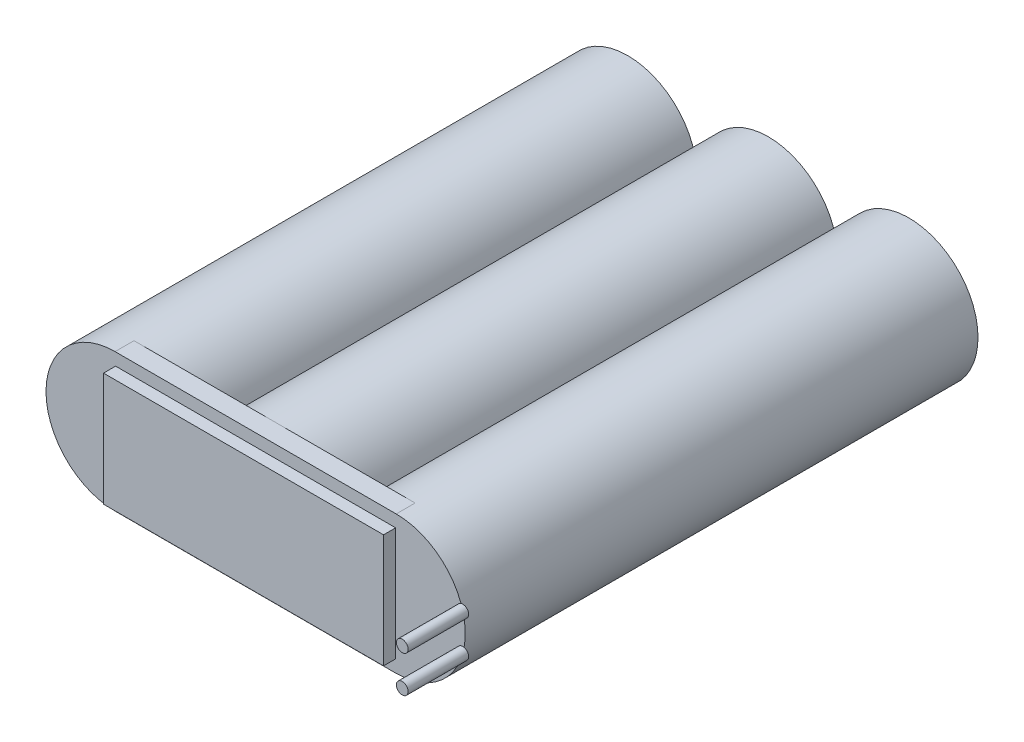
ISO-10303-21;
HEADER;
FILE_DESCRIPTION(('STEP AP214'),'2;1');
FILE_NAME('part.step','',(''),(''),'','','');
FILE_SCHEMA(('AUTOMOTIVE_DESIGN { 1 0 10303 214 1 1 1 1 }'));
ENDSEC;
DATA;
#1=APPLICATION_CONTEXT('core data for automotive mechanical design processes');
#2=APPLICATION_PROTOCOL_DEFINITION('international standard','automotive_design',2000,#1);
#3=PRODUCT_CONTEXT('',#1,'mechanical');
#4=PRODUCT('Part','Part','',(#3));
#5=PRODUCT_RELATED_PRODUCT_CATEGORY('part','',(#4));
#6=PRODUCT_DEFINITION_FORMATION('','',#4);
#7=PRODUCT_DEFINITION_CONTEXT('part definition',#1,'design');
#8=PRODUCT_DEFINITION('design','',#6,#7);
#9=PRODUCT_DEFINITION_SHAPE('','',#8);
#10=(LENGTH_UNIT() NAMED_UNIT(*) SI_UNIT(.MILLI.,.METRE.));
#11=(NAMED_UNIT(*) PLANE_ANGLE_UNIT() SI_UNIT($,.RADIAN.));
#12=(NAMED_UNIT(*) SI_UNIT($,.STERADIAN.) SOLID_ANGLE_UNIT());
#13=UNCERTAINTY_MEASURE_WITH_UNIT(LENGTH_MEASURE(1.E-05),#10,'distance_accuracy_value','');
#14=(GEOMETRIC_REPRESENTATION_CONTEXT(3) GLOBAL_UNCERTAINTY_ASSIGNED_CONTEXT((#13)) GLOBAL_UNIT_ASSIGNED_CONTEXT((#10,
#11,#12)) REPRESENTATION_CONTEXT('',''));
#15=CARTESIAN_POINT('',(0.,0.,0.));
#16=DIRECTION('',(0.,0.,1.));
#17=DIRECTION('',(1.,0.,0.));
#18=AXIS2_PLACEMENT_3D('',#15,#16,#17);
#19=CARTESIAN_POINT('',(-18.575,0.,32.625));
#20=DIRECTION('',(0.,0.,1.));
#21=DIRECTION('',(1.,0.,0.));
#22=AXIS2_PLACEMENT_3D('',#19,#20,#21);
#23=PLANE('',#22);
#24=CARTESIAN_POINT('',(18.575,0.,32.625));
#25=DIRECTION('',(0.,0.,1.));
#26=DIRECTION('',(1.,0.,0.));
#27=AXIS2_PLACEMENT_3D('',#24,#25,#26);
#28=CIRCLE('',#27,9.125);
#29=CARTESIAN_POINT('',(18.575,9.12500000000001,32.625));
#30=VERTEX_POINT('',#29);
#31=CARTESIAN_POINT('',(18.575,-9.125,32.625));
#32=VERTEX_POINT('',#31);
#33=EDGE_CURVE('E169',#30,#32,#28,.T.);
#34=ORIENTED_EDGE('',*,*,#33,.T.);
#35=DIRECTION('',(1.,0.,0.));
#36=VECTOR('',#35,1.);
#37=CARTESIAN_POINT('',(-18.575,-9.12500000000001,32.625));
#38=LINE('',#37,#36);
#39=CARTESIAN_POINT('',(0.,-9.12500000000001,32.625));
#40=VERTEX_POINT('',#39);
#41=EDGE_CURVE('E172',#40,#32,#38,.T.);
#42=ORIENTED_EDGE('',*,*,#41,.F.);
#43=CARTESIAN_POINT('',(0.,0.,32.625));
#44=DIRECTION('',(0.,0.,1.));
#45=DIRECTION('',(1.,0.,0.));
#46=AXIS2_PLACEMENT_3D('',#43,#44,#45);
#47=CIRCLE('',#46,9.125);
#48=CARTESIAN_POINT('',(0.,9.12500000000001,32.625));
#49=VERTEX_POINT('',#48);
#50=EDGE_CURVE('E54',#40,#49,#47,.T.);
#51=ORIENTED_EDGE('',*,*,#50,.T.);
#52=DIRECTION('',(-1.,0.,0.));
#53=VECTOR('',#52,1.);
#54=CARTESIAN_POINT('',(-18.575,9.12500000000001,32.625));
#55=LINE('',#54,#53);
#56=EDGE_CURVE('E163',#30,#49,#55,.T.);
#57=ORIENTED_EDGE('',*,*,#56,.F.);
#58=EDGE_LOOP('',(#34,#42,#51,#57));
#59=FACE_BOUND('',#58,.T.);
#60=ADVANCED_FACE('F45',(#59),#23,.F.);
#61=CARTESIAN_POINT('',(0.,0.,32.625));
#62=DIRECTION('',(0.,0.,-1.));
#63=DIRECTION('',(-1.,0.,0.));
#64=AXIS2_PLACEMENT_3D('',#61,#62,#63);
#65=CYLINDRICAL_SURFACE('',#64,9.125);
#66=EDGE_CURVE('E13',#49,#40,#47,.T.);
#67=ORIENTED_EDGE('',*,*,#66,.F.);
#68=ORIENTED_EDGE('',*,*,#50,.F.);
#69=EDGE_LOOP('',(#67,#68));
#70=FACE_BOUND('',#69,.T.);
#71=CARTESIAN_POINT('',(0.,0.,-32.625));
#72=DIRECTION('',(0.,0.,1.));
#73=DIRECTION('',(1.,0.,0.));
#74=AXIS2_PLACEMENT_3D('',#71,#72,#73);
#75=CIRCLE('',#74,9.125);
#76=CARTESIAN_POINT('',(9.125,0.,-32.625));
#77=VERTEX_POINT('',#76);
#78=EDGE_CURVE('E49',#77,#77,#75,.T.);
#79=ORIENTED_EDGE('',*,*,#78,.T.);
#80=EDGE_LOOP('',(#79));
#81=FACE_BOUND('',#80,.T.);
#82=ADVANCED_FACE('F47',(#70,#81),#65,.T.);
#83=CARTESIAN_POINT('',(0.,0.,-32.625));
#84=DIRECTION('',(0.,0.,1.));
#85=DIRECTION('',(1.,0.,0.));
#86=AXIS2_PLACEMENT_3D('',#83,#84,#85);
#87=PLANE('',#86);
#88=ORIENTED_EDGE('',*,*,#78,.F.);
#89=EDGE_LOOP('',(#88));
#90=FACE_BOUND('',#89,.T.);
#91=ADVANCED_FACE('F239',(#90),#87,.F.);
#92=CARTESIAN_POINT('',(-18.575,0.,32.625));
#93=DIRECTION('',(0.,0.,1.));
#94=DIRECTION('',(1.,0.,0.));
#95=AXIS2_PLACEMENT_3D('',#92,#93,#94);
#96=CIRCLE('',#95,9.125);
#97=CARTESIAN_POINT('',(-18.575,-9.12500000000001,32.625));
#98=VERTEX_POINT('',#97);
#99=CARTESIAN_POINT('',(-18.575,9.12500000000001,32.625));
#100=VERTEX_POINT('',#99);
#101=EDGE_CURVE('E170',#98,#100,#96,.T.);
#102=ORIENTED_EDGE('',*,*,#101,.T.);
#103=EDGE_CURVE('E257',#49,#100,#55,.T.);
#104=ORIENTED_EDGE('',*,*,#103,.F.);
#105=ORIENTED_EDGE('',*,*,#66,.T.);
#106=EDGE_CURVE('E260',#98,#40,#38,.T.);
#107=ORIENTED_EDGE('',*,*,#106,.F.);
#108=EDGE_LOOP('',(#102,#104,#105,#107));
#109=FACE_BOUND('',#108,.T.);
#110=ADVANCED_FACE('F235',(#109),#23,.F.);
#111=CARTESIAN_POINT('',(-18.575,0.,35.125));
#112=DIRECTION('',(0.,0.,-1.));
#113=DIRECTION('',(-1.,0.,0.));
#114=AXIS2_PLACEMENT_3D('',#111,#112,#113);
#115=CYLINDRICAL_SURFACE('',#114,9.12500000000001);
#116=DIRECTION('',(0.,0.,-1.));
#117=VECTOR('',#116,1.);
#118=CARTESIAN_POINT('',(-18.575,9.12500000000001,35.125));
#119=LINE('',#118,#117);
#120=CARTESIAN_POINT('',(-18.575,9.12500000000001,35.125));
#121=VERTEX_POINT('',#120);
#122=EDGE_CURVE('E155',#121,#100,#119,.T.);
#123=ORIENTED_EDGE('',*,*,#122,.T.);
#124=ORIENTED_EDGE('',*,*,#101,.F.);
#125=DIRECTION('',(0.,0.,-1.));
#126=VECTOR('',#125,1.);
#127=CARTESIAN_POINT('',(-18.575,-9.12500000000001,35.125));
#128=LINE('',#127,#126);
#129=CARTESIAN_POINT('',(-18.575,-9.12500000000001,35.125));
#130=VERTEX_POINT('',#129);
#131=EDGE_CURVE('E280',#130,#98,#128,.T.);
#132=ORIENTED_EDGE('',*,*,#131,.F.);
#133=CARTESIAN_POINT('',(-18.575,0.,35.125));
#134=DIRECTION('',(0.,0.,1.));
#135=DIRECTION('',(1.,0.,0.));
#136=AXIS2_PLACEMENT_3D('',#133,#134,#135);
#137=CIRCLE('',#136,9.12500000000001);
#138=EDGE_CURVE('E162',#121,#130,#137,.T.);
#139=ORIENTED_EDGE('',*,*,#138,.F.);
#140=EDGE_LOOP('',(#123,#124,#132,#139));
#141=FACE_BOUND('',#140,.T.);
#142=CARTESIAN_POINT('',(-18.575,0.,-32.625));
#143=DIRECTION('',(0.,0.,1.));
#144=DIRECTION('',(1.,0.,0.));
#145=AXIS2_PLACEMENT_3D('',#142,#143,#144);
#146=CIRCLE('',#145,9.125);
#147=CARTESIAN_POINT('',(-9.45,0.,-32.625));
#148=VERTEX_POINT('',#147);
#149=EDGE_CURVE('E173',#148,#148,#146,.T.);
#150=ORIENTED_EDGE('',*,*,#149,.T.);
#151=EDGE_LOOP('',(#150));
#152=FACE_BOUND('',#151,.T.);
#153=ADVANCED_FACE('F244',(#141,#152),#115,.T.);
#154=CARTESIAN_POINT('',(-18.575,-9.12500000000001,35.125));
#155=DIRECTION('',(0.,1.,0.));
#156=DIRECTION('',(0.,0.,1.));
#157=AXIS2_PLACEMENT_3D('',#154,#155,#156);
#158=PLANE('',#157);
#159=ORIENTED_EDGE('',*,*,#106,.T.);
#160=ORIENTED_EDGE('',*,*,#41,.T.);
#161=DIRECTION('',(0.,0.,-1.));
#162=VECTOR('',#161,1.);
#163=CARTESIAN_POINT('',(18.575,-9.125,35.125));
#164=LINE('',#163,#162);
#165=CARTESIAN_POINT('',(18.575,-9.125,35.125));
#166=VERTEX_POINT('',#165);
#167=EDGE_CURVE('E275',#166,#32,#164,.T.);
#168=ORIENTED_EDGE('',*,*,#167,.F.);
#169=DIRECTION('',(1.,0.,0.));
#170=VECTOR('',#169,1.);
#171=CARTESIAN_POINT('',(-18.575,-9.12500000000001,35.125));
#172=LINE('',#171,#170);
#173=EDGE_CURVE('E151',#130,#166,#172,.T.);
#174=ORIENTED_EDGE('',*,*,#173,.F.);
#175=ORIENTED_EDGE('',*,*,#131,.T.);
#176=EDGE_LOOP('',(#159,#160,#168,#174,#175));
#177=FACE_BOUND('',#176,.T.);
#178=ADVANCED_FACE('F250',(#177),#158,.F.);
#179=CARTESIAN_POINT('',(18.575,0.,35.125));
#180=DIRECTION('',(0.,0.,-1.));
#181=DIRECTION('',(-1.,0.,0.));
#182=AXIS2_PLACEMENT_3D('',#179,#180,#181);
#183=CYLINDRICAL_SURFACE('',#182,9.12500000000001);
#184=ORIENTED_EDGE('',*,*,#167,.T.);
#185=ORIENTED_EDGE('',*,*,#33,.F.);
#186=DIRECTION('',(0.,0.,-1.));
#187=VECTOR('',#186,1.);
#188=CARTESIAN_POINT('',(18.575,9.12500000000001,35.125));
#189=LINE('',#188,#187);
#190=CARTESIAN_POINT('',(18.575,9.12500000000001,35.125));
#191=VERTEX_POINT('',#190);
#192=EDGE_CURVE('E273',#191,#30,#189,.T.);
#193=ORIENTED_EDGE('',*,*,#192,.F.);
#194=CARTESIAN_POINT('',(18.575,0.,35.125));
#195=DIRECTION('',(0.,0.,1.));
#196=DIRECTION('',(1.,0.,0.));
#197=AXIS2_PLACEMENT_3D('',#194,#195,#196);
#198=CIRCLE('',#197,9.12500000000001);
#199=CARTESIAN_POINT('',(27.1361699272627,3.15784649350352,35.125));
#200=VERTEX_POINT('',#199);
#201=EDGE_CURVE('E148',#200,#191,#198,.T.);
#202=ORIENTED_EDGE('',*,*,#201,.F.);
#203=CARTESIAN_POINT('',(27.5468676049892,1.6646971732257,35.125));
#204=VERTEX_POINT('',#203);
#205=EDGE_CURVE('E154',#204,#200,#198,.T.);
#206=ORIENTED_EDGE('',*,*,#205,.F.);
#207=CARTESIAN_POINT('',(27.5468676049892,-1.6646971732257,35.125));
#208=VERTEX_POINT('',#207);
#209=EDGE_CURVE('E146',#208,#204,#198,.T.);
#210=ORIENTED_EDGE('',*,*,#209,.F.);
#211=CARTESIAN_POINT('',(27.1361699272627,-3.15784649350352,35.125));
#212=VERTEX_POINT('',#211);
#213=EDGE_CURVE('E130',#212,#208,#198,.T.);
#214=ORIENTED_EDGE('',*,*,#213,.F.);
#215=EDGE_CURVE('E144',#166,#212,#198,.T.);
#216=ORIENTED_EDGE('',*,*,#215,.F.);
#217=EDGE_LOOP('',(#184,#185,#193,#202,#206,#210,#214,#216));
#218=FACE_BOUND('',#217,.T.);
#219=CARTESIAN_POINT('',(18.575,0.,-32.625));
#220=DIRECTION('',(0.,0.,1.));
#221=DIRECTION('',(1.,0.,0.));
#222=AXIS2_PLACEMENT_3D('',#219,#220,#221);
#223=CIRCLE('',#222,9.125);
#224=CARTESIAN_POINT('',(27.7,0.,-32.625));
#225=VERTEX_POINT('',#224);
#226=EDGE_CURVE('E166',#225,#225,#223,.T.);
#227=ORIENTED_EDGE('',*,*,#226,.T.);
#228=EDGE_LOOP('',(#227));
#229=FACE_BOUND('',#228,.T.);
#230=ADVANCED_FACE('F142',(#218,#229),#183,.T.);
#231=CARTESIAN_POINT('',(-18.575,9.12500000000001,35.125));
#232=DIRECTION('',(0.,-1.,0.));
#233=DIRECTION('',(0.,0.,-1.));
#234=AXIS2_PLACEMENT_3D('',#231,#232,#233);
#235=PLANE('',#234);
#236=ORIENTED_EDGE('',*,*,#56,.T.);
#237=ORIENTED_EDGE('',*,*,#103,.T.);
#238=ORIENTED_EDGE('',*,*,#122,.F.);
#239=DIRECTION('',(-1.,0.,0.));
#240=VECTOR('',#239,1.);
#241=CARTESIAN_POINT('',(-18.575,9.12500000000001,35.125));
#242=LINE('',#241,#240);
#243=EDGE_CURVE('E153',#191,#121,#242,.T.);
#244=ORIENTED_EDGE('',*,*,#243,.F.);
#245=ORIENTED_EDGE('',*,*,#192,.T.);
#246=EDGE_LOOP('',(#236,#237,#238,#244,#245));
#247=FACE_BOUND('',#246,.T.);
#248=ADVANCED_FACE('F266',(#247),#235,.F.);
#249=CARTESIAN_POINT('',(-18.575,0.,35.125));
#250=DIRECTION('',(0.,0.,1.));
#251=DIRECTION('',(1.,0.,0.));
#252=AXIS2_PLACEMENT_3D('',#249,#250,#251);
#253=PLANE('',#252);
#254=DIRECTION('',(0.,1.,0.));
#255=VECTOR('',#254,1.);
#256=CARTESIAN_POINT('',(18.5,-7.5,35.125));
#257=LINE('',#256,#255);
#258=CARTESIAN_POINT('',(18.5,-7.5,35.125));
#259=VERTEX_POINT('',#258);
#260=CARTESIAN_POINT('',(18.5,7.5,35.125));
#261=VERTEX_POINT('',#260);
#262=EDGE_CURVE('E200',#259,#261,#257,.T.);
#263=ORIENTED_EDGE('',*,*,#262,.F.);
#264=DIRECTION('',(1.,0.,0.));
#265=VECTOR('',#264,1.);
#266=CARTESIAN_POINT('',(-18.5,-7.5,35.125));
#267=LINE('',#266,#265);
#268=CARTESIAN_POINT('',(-18.5,-7.5,35.125));
#269=VERTEX_POINT('',#268);
#270=EDGE_CURVE('E190',#269,#259,#267,.T.);
#271=ORIENTED_EDGE('',*,*,#270,.F.);
#272=DIRECTION('',(0.,-1.,0.));
#273=VECTOR('',#272,1.);
#274=CARTESIAN_POINT('',(-18.5,-7.5,35.125));
#275=LINE('',#274,#273);
#276=CARTESIAN_POINT('',(-18.5,7.5,35.125));
#277=VERTEX_POINT('',#276);
#278=EDGE_CURVE('E194',#277,#269,#275,.T.);
#279=ORIENTED_EDGE('',*,*,#278,.F.);
#280=DIRECTION('',(-1.,0.,0.));
#281=VECTOR('',#280,1.);
#282=CARTESIAN_POINT('',(-18.5,7.5,35.125));
#283=LINE('',#282,#281);
#284=EDGE_CURVE('E197',#261,#277,#283,.T.);
#285=ORIENTED_EDGE('',*,*,#284,.F.);
#286=EDGE_LOOP('',(#263,#271,#279,#285));
#287=FACE_BOUND('',#286,.T.);
#288=ORIENTED_EDGE('',*,*,#215,.T.);
#289=CARTESIAN_POINT('',(27.3732512466967,-2.42,35.125));
#290=DIRECTION('',(0.,0.,1.));
#291=DIRECTION('',(1.,0.,0.));
#292=AXIS2_PLACEMENT_3D('',#289,#290,#291);
#293=CIRCLE('',#292,0.775000000000001);
#294=EDGE_CURVE('E132',#208,#212,#293,.T.);
#295=ORIENTED_EDGE('',*,*,#294,.F.);
#296=ORIENTED_EDGE('',*,*,#209,.T.);
#297=CARTESIAN_POINT('',(27.3732512466967,2.42,35.125));
#298=DIRECTION('',(0.,0.,1.));
#299=DIRECTION('',(1.,0.,0.));
#300=AXIS2_PLACEMENT_3D('',#297,#298,#299);
#301=CIRCLE('',#300,0.775000000000001);
#302=EDGE_CURVE('E211',#200,#204,#301,.T.);
#303=ORIENTED_EDGE('',*,*,#302,.F.);
#304=ORIENTED_EDGE('',*,*,#201,.T.);
#305=ORIENTED_EDGE('',*,*,#243,.T.);
#306=ORIENTED_EDGE('',*,*,#138,.T.);
#307=ORIENTED_EDGE('',*,*,#173,.T.);
#308=EDGE_LOOP('',(#288,#295,#296,#303,#304,#305,#306,#307));
#309=FACE_BOUND('',#308,.T.);
#310=ADVANCED_FACE('F149',(#287,#309),#253,.T.);
#311=CARTESIAN_POINT('',(18.575,0.,-32.625));
#312=DIRECTION('',(0.,0.,1.));
#313=DIRECTION('',(1.,0.,0.));
#314=AXIS2_PLACEMENT_3D('',#311,#312,#313);
#315=PLANE('',#314);
#316=ORIENTED_EDGE('',*,*,#226,.F.);
#317=EDGE_LOOP('',(#316));
#318=FACE_BOUND('',#317,.T.);
#319=ADVANCED_FACE('F298',(#318),#315,.F.);
#320=CARTESIAN_POINT('',(-18.575,0.,-32.625));
#321=DIRECTION('',(0.,0.,1.));
#322=DIRECTION('',(1.,0.,0.));
#323=AXIS2_PLACEMENT_3D('',#320,#321,#322);
#324=PLANE('',#323);
#325=ORIENTED_EDGE('',*,*,#149,.F.);
#326=EDGE_LOOP('',(#325));
#327=FACE_BOUND('',#326,.T.);
#328=ADVANCED_FACE('F303',(#327),#324,.F.);
#329=CARTESIAN_POINT('',(18.5,-7.5,36.725));
#330=DIRECTION('',(-1.,0.,0.));
#331=DIRECTION('',(0.,0.,1.));
#332=AXIS2_PLACEMENT_3D('',#329,#330,#331);
#333=PLANE('',#332);
#334=ORIENTED_EDGE('',*,*,#262,.T.);
#335=DIRECTION('',(0.,0.,-1.));
#336=VECTOR('',#335,1.);
#337=CARTESIAN_POINT('',(18.5,7.5,36.725));
#338=LINE('',#337,#336);
#339=CARTESIAN_POINT('',(18.5,7.5,36.725));
#340=VERTEX_POINT('',#339);
#341=EDGE_CURVE('E176',#340,#261,#338,.T.);
#342=ORIENTED_EDGE('',*,*,#341,.F.);
#343=DIRECTION('',(0.,1.,0.));
#344=VECTOR('',#343,1.);
#345=CARTESIAN_POINT('',(18.5,-7.5,36.725));
#346=LINE('',#345,#344);
#347=CARTESIAN_POINT('',(18.5,-7.5,36.725));
#348=VERTEX_POINT('',#347);
#349=EDGE_CURVE('E193',#348,#340,#346,.T.);
#350=ORIENTED_EDGE('',*,*,#349,.F.);
#351=DIRECTION('',(0.,0.,-1.));
#352=VECTOR('',#351,1.);
#353=CARTESIAN_POINT('',(18.5,-7.5,36.725));
#354=LINE('',#353,#352);
#355=EDGE_CURVE('E186',#348,#259,#354,.T.);
#356=ORIENTED_EDGE('',*,*,#355,.T.);
#357=EDGE_LOOP('',(#334,#342,#350,#356));
#358=FACE_BOUND('',#357,.T.);
#359=ADVANCED_FACE('F309',(#358),#333,.F.);
#360=CARTESIAN_POINT('',(-18.5,7.5,36.725));
#361=DIRECTION('',(0.,-1.,0.));
#362=DIRECTION('',(0.,0.,-1.));
#363=AXIS2_PLACEMENT_3D('',#360,#361,#362);
#364=PLANE('',#363);
#365=ORIENTED_EDGE('',*,*,#284,.T.);
#366=DIRECTION('',(0.,0.,-1.));
#367=VECTOR('',#366,1.);
#368=CARTESIAN_POINT('',(-18.5,7.5,36.725));
#369=LINE('',#368,#367);
#370=CARTESIAN_POINT('',(-18.5,7.5,36.725));
#371=VERTEX_POINT('',#370);
#372=EDGE_CURVE('E180',#371,#277,#369,.T.);
#373=ORIENTED_EDGE('',*,*,#372,.F.);
#374=DIRECTION('',(-1.,0.,0.));
#375=VECTOR('',#374,1.);
#376=CARTESIAN_POINT('',(-18.5,7.5,36.725));
#377=LINE('',#376,#375);
#378=EDGE_CURVE('E207',#340,#371,#377,.T.);
#379=ORIENTED_EDGE('',*,*,#378,.F.);
#380=ORIENTED_EDGE('',*,*,#341,.T.);
#381=EDGE_LOOP('',(#365,#373,#379,#380));
#382=FACE_BOUND('',#381,.T.);
#383=ADVANCED_FACE('F313',(#382),#364,.F.);
#384=CARTESIAN_POINT('',(-18.5,-7.5,36.725));
#385=DIRECTION('',(1.,0.,0.));
#386=DIRECTION('',(0.,0.,-1.));
#387=AXIS2_PLACEMENT_3D('',#384,#385,#386);
#388=PLANE('',#387);
#389=ORIENTED_EDGE('',*,*,#278,.T.);
#390=DIRECTION('',(0.,0.,-1.));
#391=VECTOR('',#390,1.);
#392=CARTESIAN_POINT('',(-18.5,-7.5,36.725));
#393=LINE('',#392,#391);
#394=CARTESIAN_POINT('',(-18.5,-7.5,36.725));
#395=VERTEX_POINT('',#394);
#396=EDGE_CURVE('E183',#395,#269,#393,.T.);
#397=ORIENTED_EDGE('',*,*,#396,.F.);
#398=DIRECTION('',(0.,-1.,0.));
#399=VECTOR('',#398,1.);
#400=CARTESIAN_POINT('',(-18.5,-7.5,36.725));
#401=LINE('',#400,#399);
#402=EDGE_CURVE('E205',#371,#395,#401,.T.);
#403=ORIENTED_EDGE('',*,*,#402,.F.);
#404=ORIENTED_EDGE('',*,*,#372,.T.);
#405=EDGE_LOOP('',(#389,#397,#403,#404));
#406=FACE_BOUND('',#405,.T.);
#407=ADVANCED_FACE('F317',(#406),#388,.F.);
#408=CARTESIAN_POINT('',(-18.5,-7.5,36.725));
#409=DIRECTION('',(0.,1.,0.));
#410=DIRECTION('',(0.,0.,1.));
#411=AXIS2_PLACEMENT_3D('',#408,#409,#410);
#412=PLANE('',#411);
#413=ORIENTED_EDGE('',*,*,#270,.T.);
#414=ORIENTED_EDGE('',*,*,#355,.F.);
#415=DIRECTION('',(1.,0.,0.));
#416=VECTOR('',#415,1.);
#417=CARTESIAN_POINT('',(-18.5,-7.5,36.725));
#418=LINE('',#417,#416);
#419=EDGE_CURVE('E189',#395,#348,#418,.T.);
#420=ORIENTED_EDGE('',*,*,#419,.F.);
#421=ORIENTED_EDGE('',*,*,#396,.T.);
#422=EDGE_LOOP('',(#413,#414,#420,#421));
#423=FACE_BOUND('',#422,.T.);
#424=ADVANCED_FACE('F321',(#423),#412,.F.);
#425=CARTESIAN_POINT('',(0.,0.,36.725));
#426=DIRECTION('',(0.,0.,-1.));
#427=DIRECTION('',(-1.,0.,0.));
#428=AXIS2_PLACEMENT_3D('',#425,#426,#427);
#429=PLANE('',#428);
#430=ORIENTED_EDGE('',*,*,#349,.T.);
#431=ORIENTED_EDGE('',*,*,#378,.T.);
#432=ORIENTED_EDGE('',*,*,#402,.T.);
#433=ORIENTED_EDGE('',*,*,#419,.T.);
#434=EDGE_LOOP('',(#430,#431,#432,#433));
#435=FACE_BOUND('',#434,.T.);
#436=ADVANCED_FACE('F325',(#435),#429,.F.);
#437=CARTESIAN_POINT('',(27.3732512466967,2.42,43.125));
#438=DIRECTION('',(0.,0.,-1.));
#439=DIRECTION('',(-1.,0.,0.));
#440=AXIS2_PLACEMENT_3D('',#437,#438,#439);
#441=CYLINDRICAL_SURFACE('',#440,0.775000000000001);
#442=CARTESIAN_POINT('',(27.3732512466967,2.42,43.125));
#443=DIRECTION('',(0.,0.,1.));
#444=DIRECTION('',(1.,0.,0.));
#445=AXIS2_PLACEMENT_3D('',#442,#443,#444);
#446=CIRCLE('',#445,0.775000000000001);
#447=CARTESIAN_POINT('',(28.1482512466967,2.42,43.125));
#448=VERTEX_POINT('',#447);
#449=EDGE_CURVE('E203',#448,#448,#446,.T.);
#450=ORIENTED_EDGE('',*,*,#449,.F.);
#451=EDGE_LOOP('',(#450));
#452=FACE_BOUND('',#451,.T.);
#453=ORIENTED_EDGE('',*,*,#302,.T.);
#454=EDGE_CURVE('E67',#204,#200,#301,.T.);
#455=ORIENTED_EDGE('',*,*,#454,.T.);
#456=EDGE_LOOP('',(#453,#455));
#457=FACE_BOUND('',#456,.T.);
#458=ADVANCED_FACE('F329',(#452,#457),#441,.T.);
#459=CARTESIAN_POINT('',(27.3732512466967,2.42,43.125));
#460=DIRECTION('',(0.,0.,1.));
#461=DIRECTION('',(1.,0.,0.));
#462=AXIS2_PLACEMENT_3D('',#459,#460,#461);
#463=PLANE('',#462);
#464=ORIENTED_EDGE('',*,*,#449,.T.);
#465=EDGE_LOOP('',(#464));
#466=FACE_BOUND('',#465,.T.);
#467=ADVANCED_FACE('F228',(#466),#463,.T.);
#468=CARTESIAN_POINT('',(27.3732512466967,2.42,35.125));
#469=DIRECTION('',(0.,0.,1.));
#470=DIRECTION('',(1.,0.,0.));
#471=AXIS2_PLACEMENT_3D('',#468,#469,#470);
#472=PLANE('',#471);
#473=ORIENTED_EDGE('',*,*,#454,.F.);
#474=ORIENTED_EDGE('',*,*,#205,.T.);
#475=EDGE_LOOP('',(#473,#474));
#476=FACE_BOUND('',#475,.T.);
#477=ADVANCED_FACE('F221',(#476),#472,.F.);
#478=CARTESIAN_POINT('',(27.3732512466967,-2.42,43.125));
#479=DIRECTION('',(0.,0.,-1.));
#480=DIRECTION('',(-1.,0.,0.));
#481=AXIS2_PLACEMENT_3D('',#478,#479,#480);
#482=CYLINDRICAL_SURFACE('',#481,0.775000000000001);
#483=CARTESIAN_POINT('',(27.3732512466967,-2.42,43.125));
#484=DIRECTION('',(0.,0.,1.));
#485=DIRECTION('',(1.,0.,0.));
#486=AXIS2_PLACEMENT_3D('',#483,#484,#485);
#487=CIRCLE('',#486,0.775000000000001);
#488=CARTESIAN_POINT('',(28.1482512466967,-2.42,43.125));
#489=VERTEX_POINT('',#488);
#490=EDGE_CURVE('E138',#489,#489,#487,.T.);
#491=ORIENTED_EDGE('',*,*,#490,.F.);
#492=EDGE_LOOP('',(#491));
#493=FACE_BOUND('',#492,.T.);
#494=ORIENTED_EDGE('',*,*,#294,.T.);
#495=EDGE_CURVE('E60',#212,#208,#293,.T.);
#496=ORIENTED_EDGE('',*,*,#495,.T.);
#497=EDGE_LOOP('',(#494,#496));
#498=FACE_BOUND('',#497,.T.);
#499=ADVANCED_FACE('F134',(#493,#498),#482,.T.);
#500=CARTESIAN_POINT('',(27.3732512466967,-2.42,43.125));
#501=DIRECTION('',(0.,0.,1.));
#502=DIRECTION('',(1.,0.,0.));
#503=AXIS2_PLACEMENT_3D('',#500,#501,#502);
#504=PLANE('',#503);
#505=ORIENTED_EDGE('',*,*,#490,.T.);
#506=EDGE_LOOP('',(#505));
#507=FACE_BOUND('',#506,.T.);
#508=ADVANCED_FACE('F218',(#507),#504,.T.);
#509=CARTESIAN_POINT('',(27.3732512466967,-2.42,35.125));
#510=DIRECTION('',(0.,0.,1.));
#511=DIRECTION('',(1.,0.,0.));
#512=AXIS2_PLACEMENT_3D('',#509,#510,#511);
#513=PLANE('',#512);
#514=ORIENTED_EDGE('',*,*,#495,.F.);
#515=ORIENTED_EDGE('',*,*,#213,.T.);
#516=EDGE_LOOP('',(#514,#515));
#517=FACE_BOUND('',#516,.T.);
#518=ADVANCED_FACE('F128',(#517),#513,.F.);
#519=CLOSED_SHELL('',(#60,#82,#91,#110,#153,#178,#230,#248,#310,#319,#328,#359,#383,#407,#424,
#436,#458,#467,#477,#499,#508,#518));
#520=MANIFOLD_SOLID_BREP('B2',#519);
#521=ADVANCED_BREP_SHAPE_REPRESENTATION('',(#18,#520),#14);
#522=SHAPE_DEFINITION_REPRESENTATION(#9,#521);
ENDSEC;
END-ISO-10303-21;
